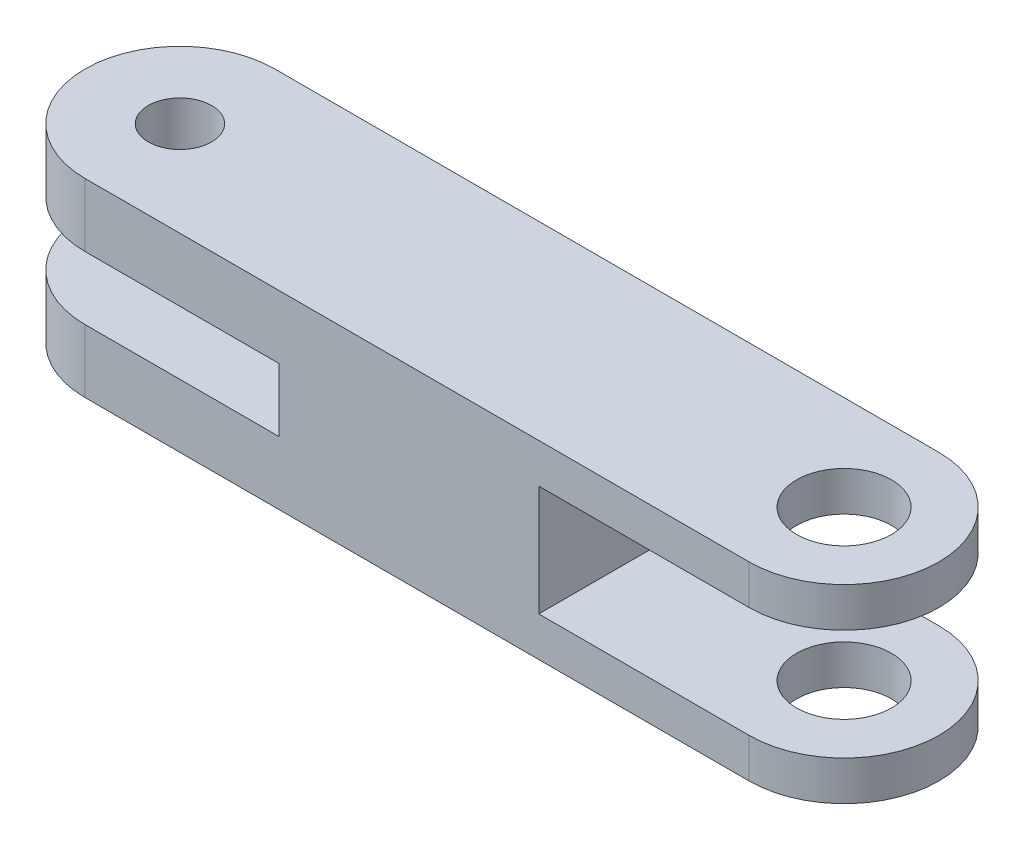
ISO-10303-21;
HEADER;
FILE_DESCRIPTION(('STEP AP214'),'2;1');
FILE_NAME('part.step','',(''),(''),'','','');
FILE_SCHEMA(('AUTOMOTIVE_DESIGN { 1 0 10303 214 1 1 1 1 }'));
ENDSEC;
DATA;
#1=APPLICATION_CONTEXT('core data for automotive mechanical design processes');
#2=APPLICATION_PROTOCOL_DEFINITION('international standard','automotive_design',2000,#1);
#3=PRODUCT_CONTEXT('',#1,'mechanical');
#4=PRODUCT('Part','Part','',(#3));
#5=PRODUCT_RELATED_PRODUCT_CATEGORY('part','',(#4));
#6=PRODUCT_DEFINITION_FORMATION('','',#4);
#7=PRODUCT_DEFINITION_CONTEXT('part definition',#1,'design');
#8=PRODUCT_DEFINITION('design','',#6,#7);
#9=PRODUCT_DEFINITION_SHAPE('','',#8);
#10=(LENGTH_UNIT() NAMED_UNIT(*) SI_UNIT(.MILLI.,.METRE.));
#11=(NAMED_UNIT(*) PLANE_ANGLE_UNIT() SI_UNIT($,.RADIAN.));
#12=(NAMED_UNIT(*) SI_UNIT($,.STERADIAN.) SOLID_ANGLE_UNIT());
#13=UNCERTAINTY_MEASURE_WITH_UNIT(LENGTH_MEASURE(1.E-05),#10,'distance_accuracy_value','');
#14=(GEOMETRIC_REPRESENTATION_CONTEXT(3) GLOBAL_UNCERTAINTY_ASSIGNED_CONTEXT((#13)) GLOBAL_UNIT_ASSIGNED_CONTEXT((#10,
#11,#12)) REPRESENTATION_CONTEXT('',''));
#15=CARTESIAN_POINT('',(0.,0.,0.));
#16=DIRECTION('',(0.,0.,1.));
#17=DIRECTION('',(1.,0.,0.));
#18=AXIS2_PLACEMENT_3D('',#15,#16,#17);
#19=CARTESIAN_POINT('',(0.,3.,0.));
#20=DIRECTION('',(0.,-1.,0.));
#21=DIRECTION('',(0.,0.,-1.));
#22=AXIS2_PLACEMENT_3D('',#19,#20,#21);
#23=CYLINDRICAL_SURFACE('',#22,3.);
#24=CARTESIAN_POINT('',(0.,1.,0.));
#25=DIRECTION('',(0.,-1.,0.));
#26=DIRECTION('',(0.,0.,-1.));
#27=AXIS2_PLACEMENT_3D('',#24,#25,#26);
#28=CIRCLE('',#27,3.);
#29=CARTESIAN_POINT('',(0.,1.,3.));
#30=VERTEX_POINT('',#29);
#31=CARTESIAN_POINT('',(0.,1.,-3.));
#32=VERTEX_POINT('',#31);
#33=EDGE_CURVE('E153',#30,#32,#28,.T.);
#34=ORIENTED_EDGE('',*,*,#33,.F.);
#35=DIRECTION('',(0.,-1.,0.));
#36=VECTOR('',#35,1.);
#37=CARTESIAN_POINT('',(0.,3.,3.));
#38=LINE('',#37,#36);
#39=CARTESIAN_POINT('',(0.,3.,3.));
#40=VERTEX_POINT('',#39);
#41=EDGE_CURVE('E148',#40,#30,#38,.T.);
#42=ORIENTED_EDGE('',*,*,#41,.F.);
#43=CARTESIAN_POINT('',(0.,3.,0.));
#44=DIRECTION('',(0.,1.,0.));
#45=DIRECTION('',(0.,0.,1.));
#46=AXIS2_PLACEMENT_3D('',#43,#44,#45);
#47=CIRCLE('',#46,3.);
#48=CARTESIAN_POINT('',(0.,3.,-3.));
#49=VERTEX_POINT('',#48);
#50=EDGE_CURVE('E200',#49,#40,#47,.T.);
#51=ORIENTED_EDGE('',*,*,#50,.F.);
#52=DIRECTION('',(0.,-1.,0.));
#53=VECTOR('',#52,1.);
#54=CARTESIAN_POINT('',(0.,3.,-3.));
#55=LINE('',#54,#53);
#56=EDGE_CURVE('E221',#49,#32,#55,.T.);
#57=ORIENTED_EDGE('',*,*,#56,.T.);
#58=EDGE_LOOP('',(#34,#42,#51,#57));
#59=FACE_BOUND('',#58,.T.);
#60=ADVANCED_FACE('F41',(#59),#23,.T.);
#61=CARTESIAN_POINT('',(0.,3.,0.));
#62=DIRECTION('',(0.,-1.,0.));
#63=DIRECTION('',(0.,0.,-1.));
#64=AXIS2_PLACEMENT_3D('',#61,#62,#63);
#65=CYLINDRICAL_SURFACE('',#64,1.);
#66=CARTESIAN_POINT('',(0.,3.,0.));
#67=DIRECTION('',(0.,1.,0.));
#68=DIRECTION('',(0.,0.,1.));
#69=AXIS2_PLACEMENT_3D('',#66,#67,#68);
#70=CIRCLE('',#69,1.);
#71=CARTESIAN_POINT('',(0.,3.,1.));
#72=VERTEX_POINT('',#71);
#73=EDGE_CURVE('E188',#72,#72,#70,.T.);
#74=ORIENTED_EDGE('',*,*,#73,.T.);
#75=EDGE_LOOP('',(#74));
#76=FACE_BOUND('',#75,.T.);
#77=CARTESIAN_POINT('',(0.,1.,0.));
#78=DIRECTION('',(0.,-1.,0.));
#79=DIRECTION('',(0.,0.,-1.));
#80=AXIS2_PLACEMENT_3D('',#77,#78,#79);
#81=CIRCLE('',#80,1.);
#82=CARTESIAN_POINT('',(0.,1.,-1.));
#83=VERTEX_POINT('',#82);
#84=EDGE_CURVE('E240',#83,#83,#81,.T.);
#85=ORIENTED_EDGE('',*,*,#84,.T.);
#86=EDGE_LOOP('',(#85));
#87=FACE_BOUND('',#86,.T.);
#88=ADVANCED_FACE('F285',(#76,#87),#65,.F.);
#89=CARTESIAN_POINT('',(0.,3.,3.));
#90=DIRECTION('',(0.,0.,-1.));
#91=DIRECTION('',(-1.,0.,0.));
#92=AXIS2_PLACEMENT_3D('',#89,#90,#91);
#93=PLANE('',#92);
#94=DIRECTION('',(0.,-1.,0.));
#95=VECTOR('',#94,1.);
#96=CARTESIAN_POINT('',(6.13903412950462,3.,3.));
#97=LINE('',#96,#95);
#98=CARTESIAN_POINT('',(6.13903412950462,1.,3.));
#99=VERTEX_POINT('',#98);
#100=CARTESIAN_POINT('',(6.13903412950462,-1.,3.));
#101=VERTEX_POINT('',#100);
#102=EDGE_CURVE('E132',#99,#101,#97,.T.);
#103=ORIENTED_EDGE('',*,*,#102,.T.);
#104=DIRECTION('',(-1.,0.,0.));
#105=VECTOR('',#104,1.);
#106=CARTESIAN_POINT('',(0.,-1.,3.));
#107=LINE('',#106,#105);
#108=CARTESIAN_POINT('',(0.,-1.,3.));
#109=VERTEX_POINT('',#108);
#110=EDGE_CURVE('E139',#101,#109,#107,.T.);
#111=ORIENTED_EDGE('',*,*,#110,.T.);
#112=CARTESIAN_POINT('',(0.,-3.,3.));
#113=VERTEX_POINT('',#112);
#114=EDGE_CURVE('E232',#109,#113,#38,.T.);
#115=ORIENTED_EDGE('',*,*,#114,.T.);
#116=DIRECTION('',(1.,0.,0.));
#117=VECTOR('',#116,1.);
#118=CARTESIAN_POINT('',(0.,-3.,3.));
#119=LINE('',#118,#117);
#120=CARTESIAN_POINT('',(21.,-3.,3.));
#121=VERTEX_POINT('',#120);
#122=EDGE_CURVE('E213',#113,#121,#119,.T.);
#123=ORIENTED_EDGE('',*,*,#122,.T.);
#124=DIRECTION('',(0.,-1.,0.));
#125=VECTOR('',#124,1.);
#126=CARTESIAN_POINT('',(21.,3.,3.));
#127=LINE('',#126,#125);
#128=CARTESIAN_POINT('',(21.,-1.75,3.));
#129=VERTEX_POINT('',#128);
#130=EDGE_CURVE('E228',#129,#121,#127,.T.);
#131=ORIENTED_EDGE('',*,*,#130,.F.);
#132=DIRECTION('',(1.,0.,0.));
#133=VECTOR('',#132,1.);
#134=CARTESIAN_POINT('',(0.,-1.75,3.));
#135=LINE('',#134,#133);
#136=CARTESIAN_POINT('',(14.3461409194115,-1.75,3.));
#137=VERTEX_POINT('',#136);
#138=EDGE_CURVE('E182',#137,#129,#135,.T.);
#139=ORIENTED_EDGE('',*,*,#138,.F.);
#140=DIRECTION('',(0.,1.,0.));
#141=VECTOR('',#140,1.);
#142=CARTESIAN_POINT('',(14.3461409194115,3.,3.));
#143=LINE('',#142,#141);
#144=CARTESIAN_POINT('',(14.3461409194115,1.75,3.));
#145=VERTEX_POINT('',#144);
#146=EDGE_CURVE('E184',#137,#145,#143,.T.);
#147=ORIENTED_EDGE('',*,*,#146,.T.);
#148=DIRECTION('',(1.,0.,0.));
#149=VECTOR('',#148,1.);
#150=CARTESIAN_POINT('',(0.,1.75,3.));
#151=LINE('',#150,#149);
#152=CARTESIAN_POINT('',(21.,1.75,3.));
#153=VERTEX_POINT('',#152);
#154=EDGE_CURVE('E174',#145,#153,#151,.T.);
#155=ORIENTED_EDGE('',*,*,#154,.T.);
#156=CARTESIAN_POINT('',(21.,3.,3.));
#157=VERTEX_POINT('',#156);
#158=EDGE_CURVE('E229',#157,#153,#127,.T.);
#159=ORIENTED_EDGE('',*,*,#158,.F.);
#160=DIRECTION('',(1.,0.,0.));
#161=VECTOR('',#160,1.);
#162=CARTESIAN_POINT('',(0.,3.,3.));
#163=LINE('',#162,#161);
#164=EDGE_CURVE('E203',#40,#157,#163,.T.);
#165=ORIENTED_EDGE('',*,*,#164,.F.);
#166=ORIENTED_EDGE('',*,*,#41,.T.);
#167=DIRECTION('',(-1.,0.,0.));
#168=VECTOR('',#167,1.);
#169=CARTESIAN_POINT('',(0.,1.,3.));
#170=LINE('',#169,#168);
#171=EDGE_CURVE('E56',#99,#30,#170,.T.);
#172=ORIENTED_EDGE('',*,*,#171,.F.);
#173=EDGE_LOOP('',(#103,#111,#115,#123,#131,#139,#147,#155,#159,#165,#166,#172));
#174=FACE_BOUND('',#173,.T.);
#175=ADVANCED_FACE('F146',(#174),#93,.F.);
#176=CARTESIAN_POINT('',(21.,3.,0.));
#177=DIRECTION('',(0.,-1.,0.));
#178=DIRECTION('',(0.,0.,-1.));
#179=AXIS2_PLACEMENT_3D('',#176,#177,#178);
#180=CYLINDRICAL_SURFACE('',#179,3.);
#181=CARTESIAN_POINT('',(21.,-1.75,0.));
#182=DIRECTION('',(0.,1.,0.));
#183=DIRECTION('',(0.,0.,1.));
#184=AXIS2_PLACEMENT_3D('',#181,#182,#183);
#185=CIRCLE('',#184,3.);
#186=CARTESIAN_POINT('',(21.,-1.75,-3.));
#187=VERTEX_POINT('',#186);
#188=EDGE_CURVE('E180',#129,#187,#185,.T.);
#189=ORIENTED_EDGE('',*,*,#188,.F.);
#190=ORIENTED_EDGE('',*,*,#130,.T.);
#191=CARTESIAN_POINT('',(21.,-3.,0.));
#192=DIRECTION('',(0.,1.,0.));
#193=DIRECTION('',(0.,0.,1.));
#194=AXIS2_PLACEMENT_3D('',#191,#192,#193);
#195=CIRCLE('',#194,3.);
#196=CARTESIAN_POINT('',(21.,-3.,-3.));
#197=VERTEX_POINT('',#196);
#198=EDGE_CURVE('E216',#121,#197,#195,.T.);
#199=ORIENTED_EDGE('',*,*,#198,.T.);
#200=DIRECTION('',(0.,-1.,0.));
#201=VECTOR('',#200,1.);
#202=CARTESIAN_POINT('',(21.,3.,-3.));
#203=LINE('',#202,#201);
#204=EDGE_CURVE('E224',#187,#197,#203,.T.);
#205=ORIENTED_EDGE('',*,*,#204,.F.);
#206=EDGE_LOOP('',(#189,#190,#199,#205));
#207=FACE_BOUND('',#206,.T.);
#208=ADVANCED_FACE('F263',(#207),#180,.T.);
#209=CARTESIAN_POINT('',(0.,3.,-3.));
#210=DIRECTION('',(0.,0.,1.));
#211=DIRECTION('',(1.,0.,0.));
#212=AXIS2_PLACEMENT_3D('',#209,#210,#211);
#213=PLANE('',#212);
#214=CARTESIAN_POINT('',(0.,-1.,-3.));
#215=VERTEX_POINT('',#214);
#216=CARTESIAN_POINT('',(0.,-3.,-3.));
#217=VERTEX_POINT('',#216);
#218=EDGE_CURVE('E210',#215,#217,#55,.T.);
#219=ORIENTED_EDGE('',*,*,#218,.F.);
#220=DIRECTION('',(1.,0.,0.));
#221=VECTOR('',#220,1.);
#222=CARTESIAN_POINT('',(0.,-1.,-3.));
#223=LINE('',#222,#221);
#224=CARTESIAN_POINT('',(6.13903412950462,-1.,-3.));
#225=VERTEX_POINT('',#224);
#226=EDGE_CURVE('E159',#215,#225,#223,.T.);
#227=ORIENTED_EDGE('',*,*,#226,.T.);
#228=DIRECTION('',(0.,1.,0.));
#229=VECTOR('',#228,1.);
#230=CARTESIAN_POINT('',(6.13903412950462,3.,-3.));
#231=LINE('',#230,#229);
#232=CARTESIAN_POINT('',(6.13903412950462,1.,-3.));
#233=VERTEX_POINT('',#232);
#234=EDGE_CURVE('E11',#225,#233,#231,.T.);
#235=ORIENTED_EDGE('',*,*,#234,.T.);
#236=DIRECTION('',(1.,0.,0.));
#237=VECTOR('',#236,1.);
#238=CARTESIAN_POINT('',(0.,1.,-3.));
#239=LINE('',#238,#237);
#240=EDGE_CURVE('E143',#32,#233,#239,.T.);
#241=ORIENTED_EDGE('',*,*,#240,.F.);
#242=ORIENTED_EDGE('',*,*,#56,.F.);
#243=DIRECTION('',(-1.,0.,0.));
#244=VECTOR('',#243,1.);
#245=CARTESIAN_POINT('',(0.,3.,-3.));
#246=LINE('',#245,#244);
#247=CARTESIAN_POINT('',(21.,3.,-3.));
#248=VERTEX_POINT('',#247);
#249=EDGE_CURVE('E208',#248,#49,#246,.T.);
#250=ORIENTED_EDGE('',*,*,#249,.F.);
#251=CARTESIAN_POINT('',(21.,1.75,-3.));
#252=VERTEX_POINT('',#251);
#253=EDGE_CURVE('E225',#248,#252,#203,.T.);
#254=ORIENTED_EDGE('',*,*,#253,.T.);
#255=DIRECTION('',(-1.,0.,0.));
#256=VECTOR('',#255,1.);
#257=CARTESIAN_POINT('',(0.,1.75,-3.));
#258=LINE('',#257,#256);
#259=CARTESIAN_POINT('',(14.3461409194115,1.75,-3.));
#260=VERTEX_POINT('',#259);
#261=EDGE_CURVE('E168',#252,#260,#258,.T.);
#262=ORIENTED_EDGE('',*,*,#261,.T.);
#263=DIRECTION('',(0.,-1.,0.));
#264=VECTOR('',#263,1.);
#265=CARTESIAN_POINT('',(14.3461409194115,3.,-3.));
#266=LINE('',#265,#264);
#267=CARTESIAN_POINT('',(14.3461409194115,-1.75,-3.));
#268=VERTEX_POINT('',#267);
#269=EDGE_CURVE('E49',#260,#268,#266,.T.);
#270=ORIENTED_EDGE('',*,*,#269,.T.);
#271=DIRECTION('',(-1.,0.,0.));
#272=VECTOR('',#271,1.);
#273=CARTESIAN_POINT('',(0.,-1.75,-3.));
#274=LINE('',#273,#272);
#275=EDGE_CURVE('E178',#187,#268,#274,.T.);
#276=ORIENTED_EDGE('',*,*,#275,.F.);
#277=ORIENTED_EDGE('',*,*,#204,.T.);
#278=DIRECTION('',(-1.,0.,0.));
#279=VECTOR('',#278,1.);
#280=CARTESIAN_POINT('',(0.,-3.,-3.));
#281=LINE('',#280,#279);
#282=EDGE_CURVE('E204',#197,#217,#281,.T.);
#283=ORIENTED_EDGE('',*,*,#282,.T.);
#284=EDGE_LOOP('',(#219,#227,#235,#241,#242,#250,#254,#262,#270,#276,#277,#283));
#285=FACE_BOUND('',#284,.T.);
#286=ADVANCED_FACE('F249',(#285),#213,.F.);
#287=CARTESIAN_POINT('',(21.,3.,0.));
#288=DIRECTION('',(0.,-1.,0.));
#289=DIRECTION('',(0.,0.,-1.));
#290=AXIS2_PLACEMENT_3D('',#287,#288,#289);
#291=CYLINDRICAL_SURFACE('',#290,1.5);
#292=CARTESIAN_POINT('',(21.,-3.,0.));
#293=DIRECTION('',(0.,1.,0.));
#294=DIRECTION('',(0.,0.,1.));
#295=AXIS2_PLACEMENT_3D('',#292,#293,#294);
#296=CIRCLE('',#295,1.5);
#297=CARTESIAN_POINT('',(21.,-3.,1.5));
#298=VERTEX_POINT('',#297);
#299=EDGE_CURVE('E191',#298,#298,#296,.T.);
#300=ORIENTED_EDGE('',*,*,#299,.F.);
#301=EDGE_LOOP('',(#300));
#302=FACE_BOUND('',#301,.T.);
#303=CARTESIAN_POINT('',(21.,-1.75,0.));
#304=DIRECTION('',(0.,1.,0.));
#305=DIRECTION('',(0.,0.,1.));
#306=AXIS2_PLACEMENT_3D('',#303,#304,#305);
#307=CIRCLE('',#306,1.5);
#308=CARTESIAN_POINT('',(21.,-1.75,1.5));
#309=VERTEX_POINT('',#308);
#310=EDGE_CURVE('E177',#309,#309,#307,.T.);
#311=ORIENTED_EDGE('',*,*,#310,.T.);
#312=EDGE_LOOP('',(#311));
#313=FACE_BOUND('',#312,.T.);
#314=ADVANCED_FACE('F307',(#302,#313),#291,.F.);
#315=CARTESIAN_POINT('',(0.,3.,0.));
#316=DIRECTION('',(0.,1.,0.));
#317=DIRECTION('',(0.,0.,1.));
#318=AXIS2_PLACEMENT_3D('',#315,#316,#317);
#319=PLANE('',#318);
#320=CARTESIAN_POINT('',(21.,3.,0.));
#321=DIRECTION('',(0.,1.,0.));
#322=DIRECTION('',(0.,0.,1.));
#323=AXIS2_PLACEMENT_3D('',#320,#321,#322);
#324=CIRCLE('',#323,1.5);
#325=CARTESIAN_POINT('',(21.,3.,1.5));
#326=VERTEX_POINT('',#325);
#327=EDGE_CURVE('E194',#326,#326,#324,.T.);
#328=ORIENTED_EDGE('',*,*,#327,.F.);
#329=EDGE_LOOP('',(#328));
#330=FACE_BOUND('',#329,.T.);
#331=ORIENTED_EDGE('',*,*,#50,.T.);
#332=ORIENTED_EDGE('',*,*,#164,.T.);
#333=CARTESIAN_POINT('',(21.,3.,0.));
#334=DIRECTION('',(0.,1.,0.));
#335=DIRECTION('',(0.,0.,1.));
#336=AXIS2_PLACEMENT_3D('',#333,#334,#335);
#337=CIRCLE('',#336,3.);
#338=EDGE_CURVE('E206',#157,#248,#337,.T.);
#339=ORIENTED_EDGE('',*,*,#338,.T.);
#340=ORIENTED_EDGE('',*,*,#249,.T.);
#341=EDGE_LOOP('',(#331,#332,#339,#340));
#342=FACE_BOUND('',#341,.T.);
#343=ORIENTED_EDGE('',*,*,#73,.F.);
#344=EDGE_LOOP('',(#343));
#345=FACE_BOUND('',#344,.T.);
#346=ADVANCED_FACE('F280',(#330,#342,#345),#319,.T.);
#347=CARTESIAN_POINT('',(0.,-3.,0.));
#348=DIRECTION('',(0.,1.,0.));
#349=DIRECTION('',(0.,0.,1.));
#350=AXIS2_PLACEMENT_3D('',#347,#348,#349);
#351=PLANE('',#350);
#352=CARTESIAN_POINT('',(0.,-3.,0.));
#353=DIRECTION('',(0.,1.,0.));
#354=DIRECTION('',(0.,0.,1.));
#355=AXIS2_PLACEMENT_3D('',#352,#353,#354);
#356=CIRCLE('',#355,3.);
#357=EDGE_CURVE('E197',#217,#113,#356,.T.);
#358=ORIENTED_EDGE('',*,*,#357,.F.);
#359=ORIENTED_EDGE('',*,*,#282,.F.);
#360=ORIENTED_EDGE('',*,*,#198,.F.);
#361=ORIENTED_EDGE('',*,*,#122,.F.);
#362=EDGE_LOOP('',(#358,#359,#360,#361));
#363=FACE_BOUND('',#362,.T.);
#364=ORIENTED_EDGE('',*,*,#299,.T.);
#365=EDGE_LOOP('',(#364));
#366=FACE_BOUND('',#365,.T.);
#367=CARTESIAN_POINT('',(0.,-3.,0.));
#368=DIRECTION('',(0.,1.,0.));
#369=DIRECTION('',(0.,0.,1.));
#370=AXIS2_PLACEMENT_3D('',#367,#368,#369);
#371=CIRCLE('',#370,1.);
#372=CARTESIAN_POINT('',(0.,-3.,1.));
#373=VERTEX_POINT('',#372);
#374=EDGE_CURVE('E187',#373,#373,#371,.T.);
#375=ORIENTED_EDGE('',*,*,#374,.T.);
#376=EDGE_LOOP('',(#375));
#377=FACE_BOUND('',#376,.T.);
#378=ADVANCED_FACE('F258',(#363,#366,#377),#351,.F.);
#379=ORIENTED_EDGE('',*,*,#114,.F.);
#380=CARTESIAN_POINT('',(0.,-1.,0.));
#381=DIRECTION('',(0.,-1.,0.));
#382=DIRECTION('',(0.,0.,-1.));
#383=AXIS2_PLACEMENT_3D('',#380,#381,#382);
#384=CIRCLE('',#383,3.);
#385=EDGE_CURVE('E152',#109,#215,#384,.T.);
#386=ORIENTED_EDGE('',*,*,#385,.T.);
#387=ORIENTED_EDGE('',*,*,#218,.T.);
#388=ORIENTED_EDGE('',*,*,#357,.T.);
#389=EDGE_LOOP('',(#379,#386,#387,#388));
#390=FACE_BOUND('',#389,.T.);
#391=ADVANCED_FACE('F43',(#390),#23,.T.);
#392=ORIENTED_EDGE('',*,*,#158,.T.);
#393=CARTESIAN_POINT('',(21.,1.75,0.));
#394=DIRECTION('',(0.,1.,0.));
#395=DIRECTION('',(0.,0.,1.));
#396=AXIS2_PLACEMENT_3D('',#393,#394,#395);
#397=CIRCLE('',#396,3.);
#398=EDGE_CURVE('E171',#153,#252,#397,.T.);
#399=ORIENTED_EDGE('',*,*,#398,.T.);
#400=ORIENTED_EDGE('',*,*,#253,.F.);
#401=ORIENTED_EDGE('',*,*,#338,.F.);
#402=EDGE_LOOP('',(#392,#399,#400,#401));
#403=FACE_BOUND('',#402,.T.);
#404=ADVANCED_FACE('F275',(#403),#180,.T.);
#405=CARTESIAN_POINT('',(21.,1.75,0.));
#406=DIRECTION('',(0.,1.,0.));
#407=DIRECTION('',(0.,0.,1.));
#408=AXIS2_PLACEMENT_3D('',#405,#406,#407);
#409=CIRCLE('',#408,1.5);
#410=CARTESIAN_POINT('',(21.,1.75,1.5));
#411=VERTEX_POINT('',#410);
#412=EDGE_CURVE('E166',#411,#411,#409,.T.);
#413=ORIENTED_EDGE('',*,*,#412,.F.);
#414=EDGE_LOOP('',(#413));
#415=FACE_BOUND('',#414,.T.);
#416=ORIENTED_EDGE('',*,*,#327,.T.);
#417=EDGE_LOOP('',(#416));
#418=FACE_BOUND('',#417,.T.);
#419=ADVANCED_FACE('F299',(#415,#418),#291,.F.);
#420=CARTESIAN_POINT('',(0.,-1.,0.));
#421=DIRECTION('',(0.,-1.,0.));
#422=DIRECTION('',(0.,0.,-1.));
#423=AXIS2_PLACEMENT_3D('',#420,#421,#422);
#424=CIRCLE('',#423,1.);
#425=CARTESIAN_POINT('',(0.,-1.,-1.));
#426=VERTEX_POINT('',#425);
#427=EDGE_CURVE('E149',#426,#426,#424,.T.);
#428=ORIENTED_EDGE('',*,*,#427,.F.);
#429=EDGE_LOOP('',(#428));
#430=FACE_BOUND('',#429,.T.);
#431=ORIENTED_EDGE('',*,*,#374,.F.);
#432=EDGE_LOOP('',(#431));
#433=FACE_BOUND('',#432,.T.);
#434=ADVANCED_FACE('F292',(#430,#433),#65,.F.);
#435=CARTESIAN_POINT('',(14.3461409194115,-1.75,-7.84320747138726));
#436=DIRECTION('',(-1.,0.,0.));
#437=DIRECTION('',(0.,0.,1.));
#438=AXIS2_PLACEMENT_3D('',#435,#436,#437);
#439=PLANE('',#438);
#440=DIRECTION('',(0.,0.,1.));
#441=VECTOR('',#440,1.);
#442=CARTESIAN_POINT('',(14.3461409194115,-1.75,-7.84320747138726));
#443=LINE('',#442,#441);
#444=EDGE_CURVE('E163',#268,#137,#443,.T.);
#445=ORIENTED_EDGE('',*,*,#444,.F.);
#446=ORIENTED_EDGE('',*,*,#269,.F.);
#447=DIRECTION('',(0.,0.,1.));
#448=VECTOR('',#447,1.);
#449=CARTESIAN_POINT('',(14.3461409194115,1.75,-7.84320747138726));
#450=LINE('',#449,#448);
#451=EDGE_CURVE('E64',#260,#145,#450,.T.);
#452=ORIENTED_EDGE('',*,*,#451,.T.);
#453=ORIENTED_EDGE('',*,*,#146,.F.);
#454=EDGE_LOOP('',(#445,#446,#452,#453));
#455=FACE_BOUND('',#454,.T.);
#456=ADVANCED_FACE('F270',(#455),#439,.F.);
#457=CARTESIAN_POINT('',(0.,-1.75,0.));
#458=DIRECTION('',(0.,1.,0.));
#459=DIRECTION('',(0.,0.,1.));
#460=AXIS2_PLACEMENT_3D('',#457,#458,#459);
#461=PLANE('',#460);
#462=ORIENTED_EDGE('',*,*,#310,.F.);
#463=EDGE_LOOP('',(#462));
#464=FACE_BOUND('',#463,.T.);
#465=ORIENTED_EDGE('',*,*,#138,.T.);
#466=ORIENTED_EDGE('',*,*,#188,.T.);
#467=ORIENTED_EDGE('',*,*,#275,.T.);
#468=ORIENTED_EDGE('',*,*,#444,.T.);
#469=EDGE_LOOP('',(#465,#466,#467,#468));
#470=FACE_BOUND('',#469,.T.);
#471=ADVANCED_FACE('F266',(#464,#470),#461,.T.);
#472=CARTESIAN_POINT('',(0.,1.75,0.));
#473=DIRECTION('',(0.,1.,0.));
#474=DIRECTION('',(0.,0.,1.));
#475=AXIS2_PLACEMENT_3D('',#472,#473,#474);
#476=PLANE('',#475);
#477=ORIENTED_EDGE('',*,*,#412,.T.);
#478=EDGE_LOOP('',(#477));
#479=FACE_BOUND('',#478,.T.);
#480=ORIENTED_EDGE('',*,*,#451,.F.);
#481=ORIENTED_EDGE('',*,*,#261,.F.);
#482=ORIENTED_EDGE('',*,*,#398,.F.);
#483=ORIENTED_EDGE('',*,*,#154,.F.);
#484=EDGE_LOOP('',(#480,#481,#482,#483));
#485=FACE_BOUND('',#484,.T.);
#486=ADVANCED_FACE('F273',(#479,#485),#476,.F.);
#487=CARTESIAN_POINT('',(6.13903412950462,-1.,-5.03584344586886));
#488=DIRECTION('',(1.,0.,0.));
#489=DIRECTION('',(0.,0.,-1.));
#490=AXIS2_PLACEMENT_3D('',#487,#488,#489);
#491=PLANE('',#490);
#492=DIRECTION('',(0.,0.,-1.));
#493=VECTOR('',#492,1.);
#494=CARTESIAN_POINT('',(6.13903412950462,1.,-5.03584344586886));
#495=LINE('',#494,#493);
#496=EDGE_CURVE('E134',#99,#233,#495,.T.);
#497=ORIENTED_EDGE('',*,*,#496,.T.);
#498=ORIENTED_EDGE('',*,*,#234,.F.);
#499=DIRECTION('',(0.,0.,-1.));
#500=VECTOR('',#499,1.);
#501=CARTESIAN_POINT('',(6.13903412950462,-1.,-5.03584344586886));
#502=LINE('',#501,#500);
#503=EDGE_CURVE('E136',#101,#225,#502,.T.);
#504=ORIENTED_EDGE('',*,*,#503,.F.);
#505=ORIENTED_EDGE('',*,*,#102,.F.);
#506=EDGE_LOOP('',(#497,#498,#504,#505));
#507=FACE_BOUND('',#506,.T.);
#508=ADVANCED_FACE('F133',(#507),#491,.F.);
#509=CARTESIAN_POINT('',(0.,-1.,0.));
#510=DIRECTION('',(0.,-1.,0.));
#511=DIRECTION('',(0.,0.,-1.));
#512=AXIS2_PLACEMENT_3D('',#509,#510,#511);
#513=PLANE('',#512);
#514=ORIENTED_EDGE('',*,*,#427,.T.);
#515=EDGE_LOOP('',(#514));
#516=FACE_BOUND('',#515,.T.);
#517=ORIENTED_EDGE('',*,*,#503,.T.);
#518=ORIENTED_EDGE('',*,*,#226,.F.);
#519=ORIENTED_EDGE('',*,*,#385,.F.);
#520=ORIENTED_EDGE('',*,*,#110,.F.);
#521=EDGE_LOOP('',(#517,#518,#519,#520));
#522=FACE_BOUND('',#521,.T.);
#523=ADVANCED_FACE('F246',(#516,#522),#513,.F.);
#524=CARTESIAN_POINT('',(0.,1.,0.));
#525=DIRECTION('',(0.,-1.,0.));
#526=DIRECTION('',(0.,0.,-1.));
#527=AXIS2_PLACEMENT_3D('',#524,#525,#526);
#528=PLANE('',#527);
#529=ORIENTED_EDGE('',*,*,#84,.F.);
#530=EDGE_LOOP('',(#529));
#531=FACE_BOUND('',#530,.T.);
#532=ORIENTED_EDGE('',*,*,#171,.T.);
#533=ORIENTED_EDGE('',*,*,#33,.T.);
#534=ORIENTED_EDGE('',*,*,#240,.T.);
#535=ORIENTED_EDGE('',*,*,#496,.F.);
#536=EDGE_LOOP('',(#532,#533,#534,#535));
#537=FACE_BOUND('',#536,.T.);
#538=ADVANCED_FACE('F141',(#531,#537),#528,.T.);
#539=CLOSED_SHELL('',(#60,#88,#175,#208,#286,#314,#346,#378,#391,#404,#419,#434,#456,#471,#486,
#508,#523,#538));
#540=MANIFOLD_SOLID_BREP('B2',#539);
#541=ADVANCED_BREP_SHAPE_REPRESENTATION('',(#18,#540),#14);
#542=SHAPE_DEFINITION_REPRESENTATION(#9,#541);
ENDSEC;
END-ISO-10303-21;
